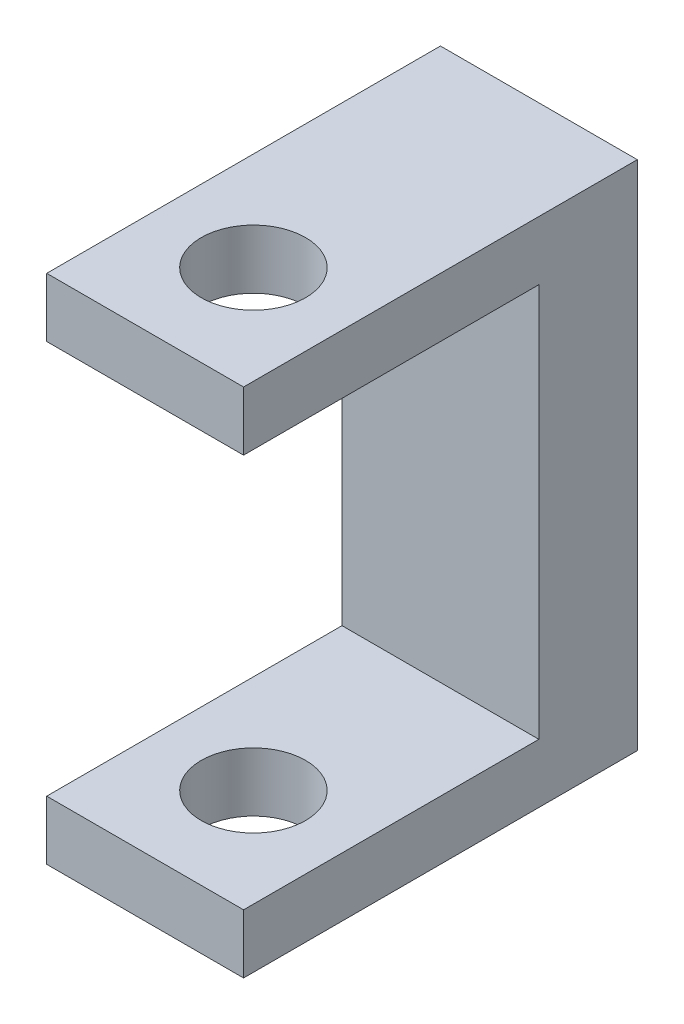
ISO-10303-21;
HEADER;
FILE_DESCRIPTION(('STEP AP214'),'2;1');
FILE_NAME('part.step','',(''),(''),'','','');
FILE_SCHEMA(('AUTOMOTIVE_DESIGN { 1 0 10303 214 1 1 1 1 }'));
ENDSEC;
DATA;
#1=APPLICATION_CONTEXT('core data for automotive mechanical design processes');
#2=APPLICATION_PROTOCOL_DEFINITION('international standard','automotive_design',2000,#1);
#3=PRODUCT_CONTEXT('',#1,'mechanical');
#4=PRODUCT('Part','Part','',(#3));
#5=PRODUCT_RELATED_PRODUCT_CATEGORY('part','',(#4));
#6=PRODUCT_DEFINITION_FORMATION('','',#4);
#7=PRODUCT_DEFINITION_CONTEXT('part definition',#1,'design');
#8=PRODUCT_DEFINITION('design','',#6,#7);
#9=PRODUCT_DEFINITION_SHAPE('','',#8);
#10=(LENGTH_UNIT() NAMED_UNIT(*) SI_UNIT(.MILLI.,.METRE.));
#11=(NAMED_UNIT(*) PLANE_ANGLE_UNIT() SI_UNIT($,.RADIAN.));
#12=(NAMED_UNIT(*) SI_UNIT($,.STERADIAN.) SOLID_ANGLE_UNIT());
#13=UNCERTAINTY_MEASURE_WITH_UNIT(LENGTH_MEASURE(1.E-05),#10,'distance_accuracy_value','');
#14=(GEOMETRIC_REPRESENTATION_CONTEXT(3) GLOBAL_UNCERTAINTY_ASSIGNED_CONTEXT((#13)) GLOBAL_UNIT_ASSIGNED_CONTEXT((#10,
#11,#12)) REPRESENTATION_CONTEXT('',''));
#15=CARTESIAN_POINT('',(0.,0.,0.));
#16=DIRECTION('',(0.,0.,1.));
#17=DIRECTION('',(1.,0.,0.));
#18=AXIS2_PLACEMENT_3D('',#15,#16,#17);
#19=CARTESIAN_POINT('',(0.,0.,20.));
#20=DIRECTION('',(0.,0.,-1.));
#21=DIRECTION('',(-1.,0.,0.));
#22=AXIS2_PLACEMENT_3D('',#19,#20,#21);
#23=PLANE('',#22);
#24=DIRECTION('',(0.,1.,0.));
#25=VECTOR('',#24,1.);
#26=CARTESIAN_POINT('',(5.,-13.,20.));
#27=LINE('',#26,#25);
#28=CARTESIAN_POINT('',(5.,-13.,20.));
#29=VERTEX_POINT('',#28);
#30=CARTESIAN_POINT('',(5.,-10.,20.));
#31=VERTEX_POINT('',#30);
#32=EDGE_CURVE('E158',#29,#31,#27,.T.);
#33=ORIENTED_EDGE('',*,*,#32,.T.);
#34=DIRECTION('',(1.,0.,0.));
#35=VECTOR('',#34,1.);
#36=CARTESIAN_POINT('',(-5.,-10.,20.));
#37=LINE('',#36,#35);
#38=CARTESIAN_POINT('',(-5.,-10.,20.));
#39=VERTEX_POINT('',#38);
#40=EDGE_CURVE('E137',#39,#31,#37,.T.);
#41=ORIENTED_EDGE('',*,*,#40,.F.);
#42=DIRECTION('',(0.,-1.,0.));
#43=VECTOR('',#42,1.);
#44=CARTESIAN_POINT('',(-5.,-13.,20.));
#45=LINE('',#44,#43);
#46=CARTESIAN_POINT('',(-5.,-13.,20.));
#47=VERTEX_POINT('',#46);
#48=EDGE_CURVE('E152',#39,#47,#45,.T.);
#49=ORIENTED_EDGE('',*,*,#48,.T.);
#50=DIRECTION('',(1.,0.,0.));
#51=VECTOR('',#50,1.);
#52=CARTESIAN_POINT('',(5.,-13.,20.));
#53=LINE('',#52,#51);
#54=EDGE_CURVE('E155',#47,#29,#53,.T.);
#55=ORIENTED_EDGE('',*,*,#54,.T.);
#56=EDGE_LOOP('',(#33,#41,#49,#55));
#57=FACE_BOUND('',#56,.T.);
#58=ADVANCED_FACE('F45',(#57),#23,.F.);
#59=CARTESIAN_POINT('',(5.,13.,20.));
#60=DIRECTION('',(0.,-1.,0.));
#61=DIRECTION('',(0.,0.,-1.));
#62=AXIS2_PLACEMENT_3D('',#59,#60,#61);
#63=PLANE('',#62);
#64=CARTESIAN_POINT('',(0.,13.,14.5));
#65=DIRECTION('',(0.,-1.,0.));
#66=DIRECTION('',(0.,0.,-1.));
#67=AXIS2_PLACEMENT_3D('',#64,#65,#66);
#68=CIRCLE('',#67,2.65);
#69=CARTESIAN_POINT('',(0.,13.,11.85));
#70=VERTEX_POINT('',#69);
#71=EDGE_CURVE('E313',#70,#70,#68,.T.);
#72=ORIENTED_EDGE('',*,*,#71,.T.);
#73=EDGE_LOOP('',(#72));
#74=FACE_BOUND('',#73,.T.);
#75=DIRECTION('',(-1.,0.,0.));
#76=VECTOR('',#75,1.);
#77=CARTESIAN_POINT('',(5.,13.,0.));
#78=LINE('',#77,#76);
#79=CARTESIAN_POINT('',(5.,13.,0.));
#80=VERTEX_POINT('',#79);
#81=CARTESIAN_POINT('',(-5.,13.,0.));
#82=VERTEX_POINT('',#81);
#83=EDGE_CURVE('E163',#80,#82,#78,.T.);
#84=ORIENTED_EDGE('',*,*,#83,.T.);
#85=DIRECTION('',(0.,0.,-1.));
#86=VECTOR('',#85,1.);
#87=CARTESIAN_POINT('',(-5.,13.,20.));
#88=LINE('',#87,#86);
#89=CARTESIAN_POINT('',(-5.,13.,20.));
#90=VERTEX_POINT('',#89);
#91=EDGE_CURVE('E11',#90,#82,#88,.T.);
#92=ORIENTED_EDGE('',*,*,#91,.F.);
#93=DIRECTION('',(-1.,0.,0.));
#94=VECTOR('',#93,1.);
#95=CARTESIAN_POINT('',(5.,13.,20.));
#96=LINE('',#95,#94);
#97=CARTESIAN_POINT('',(5.,13.,20.));
#98=VERTEX_POINT('',#97);
#99=EDGE_CURVE('E149',#98,#90,#96,.T.);
#100=ORIENTED_EDGE('',*,*,#99,.F.);
#101=DIRECTION('',(0.,0.,-1.));
#102=VECTOR('',#101,1.);
#103=CARTESIAN_POINT('',(5.,13.,20.));
#104=LINE('',#103,#102);
#105=EDGE_CURVE('E162',#98,#80,#104,.T.);
#106=ORIENTED_EDGE('',*,*,#105,.T.);
#107=EDGE_LOOP('',(#84,#92,#100,#106));
#108=FACE_BOUND('',#107,.T.);
#109=ADVANCED_FACE('F47',(#74,#108),#63,.F.);
#110=CARTESIAN_POINT('',(-5.,-13.,20.));
#111=DIRECTION('',(1.,0.,0.));
#112=DIRECTION('',(0.,0.,-1.));
#113=AXIS2_PLACEMENT_3D('',#110,#111,#112);
#114=PLANE('',#113);
#115=ORIENTED_EDGE('',*,*,#48,.F.);
#116=DIRECTION('',(0.,0.,1.));
#117=VECTOR('',#116,1.);
#118=CARTESIAN_POINT('',(-5.,-10.,5.));
#119=LINE('',#118,#117);
#120=CARTESIAN_POINT('',(-5.,-10.,5.));
#121=VERTEX_POINT('',#120);
#122=EDGE_CURVE('E144',#121,#39,#119,.T.);
#123=ORIENTED_EDGE('',*,*,#122,.F.);
#124=DIRECTION('',(0.,-1.,0.));
#125=VECTOR('',#124,1.);
#126=CARTESIAN_POINT('',(-5.,10.,5.));
#127=LINE('',#126,#125);
#128=CARTESIAN_POINT('',(-5.,10.,5.));
#129=VERTEX_POINT('',#128);
#130=EDGE_CURVE('E127',#129,#121,#127,.T.);
#131=ORIENTED_EDGE('',*,*,#130,.F.);
#132=DIRECTION('',(0.,0.,1.));
#133=VECTOR('',#132,1.);
#134=CARTESIAN_POINT('',(-5.,10.,5.));
#135=LINE('',#134,#133);
#136=CARTESIAN_POINT('',(-5.,10.,20.));
#137=VERTEX_POINT('',#136);
#138=EDGE_CURVE('E123',#129,#137,#135,.T.);
#139=ORIENTED_EDGE('',*,*,#138,.T.);
#140=EDGE_CURVE('E99',#90,#137,#45,.T.);
#141=ORIENTED_EDGE('',*,*,#140,.F.);
#142=ORIENTED_EDGE('',*,*,#91,.T.);
#143=DIRECTION('',(0.,-1.,0.));
#144=VECTOR('',#143,1.);
#145=CARTESIAN_POINT('',(-5.,-13.,0.));
#146=LINE('',#145,#144);
#147=CARTESIAN_POINT('',(-5.,-13.,0.));
#148=VERTEX_POINT('',#147);
#149=EDGE_CURVE('E167',#82,#148,#146,.T.);
#150=ORIENTED_EDGE('',*,*,#149,.T.);
#151=DIRECTION('',(0.,0.,-1.));
#152=VECTOR('',#151,1.);
#153=CARTESIAN_POINT('',(-5.,-13.,20.));
#154=LINE('',#153,#152);
#155=EDGE_CURVE('E55',#47,#148,#154,.T.);
#156=ORIENTED_EDGE('',*,*,#155,.F.);
#157=EDGE_LOOP('',(#115,#123,#131,#139,#141,#142,#150,#156));
#158=FACE_BOUND('',#157,.T.);
#159=ADVANCED_FACE('F216',(#158),#114,.F.);
#160=CARTESIAN_POINT('',(5.,-13.,20.));
#161=DIRECTION('',(0.,1.,0.));
#162=DIRECTION('',(0.,0.,1.));
#163=AXIS2_PLACEMENT_3D('',#160,#161,#162);
#164=PLANE('',#163);
#165=CARTESIAN_POINT('',(0.,-13.,14.5));
#166=DIRECTION('',(0.,-1.,0.));
#167=DIRECTION('',(0.,0.,-1.));
#168=AXIS2_PLACEMENT_3D('',#165,#166,#167);
#169=CIRCLE('',#168,2.65);
#170=CARTESIAN_POINT('',(0.,-13.,11.85));
#171=VERTEX_POINT('',#170);
#172=EDGE_CURVE('E310',#171,#171,#169,.T.);
#173=ORIENTED_EDGE('',*,*,#172,.F.);
#174=EDGE_LOOP('',(#173));
#175=FACE_BOUND('',#174,.T.);
#176=DIRECTION('',(1.,0.,0.));
#177=VECTOR('',#176,1.);
#178=CARTESIAN_POINT('',(5.,-13.,0.));
#179=LINE('',#178,#177);
#180=CARTESIAN_POINT('',(5.,-13.,0.));
#181=VERTEX_POINT('',#180);
#182=EDGE_CURVE('E171',#148,#181,#179,.T.);
#183=ORIENTED_EDGE('',*,*,#182,.T.);
#184=DIRECTION('',(0.,0.,-1.));
#185=VECTOR('',#184,1.);
#186=CARTESIAN_POINT('',(5.,-13.,20.));
#187=LINE('',#186,#185);
#188=EDGE_CURVE('E178',#29,#181,#187,.T.);
#189=ORIENTED_EDGE('',*,*,#188,.F.);
#190=ORIENTED_EDGE('',*,*,#54,.F.);
#191=ORIENTED_EDGE('',*,*,#155,.T.);
#192=EDGE_LOOP('',(#183,#189,#190,#191));
#193=FACE_BOUND('',#192,.T.);
#194=ADVANCED_FACE('F187',(#175,#193),#164,.F.);
#195=CARTESIAN_POINT('',(5.,-13.,20.));
#196=DIRECTION('',(-1.,0.,0.));
#197=DIRECTION('',(0.,0.,1.));
#198=AXIS2_PLACEMENT_3D('',#195,#196,#197);
#199=PLANE('',#198);
#200=DIRECTION('',(0.,1.,0.));
#201=VECTOR('',#200,1.);
#202=CARTESIAN_POINT('',(5.,10.,5.));
#203=LINE('',#202,#201);
#204=CARTESIAN_POINT('',(5.,-10.,5.));
#205=VERTEX_POINT('',#204);
#206=CARTESIAN_POINT('',(5.,10.,5.));
#207=VERTEX_POINT('',#206);
#208=EDGE_CURVE('E128',#205,#207,#203,.T.);
#209=ORIENTED_EDGE('',*,*,#208,.F.);
#210=DIRECTION('',(0.,0.,1.));
#211=VECTOR('',#210,1.);
#212=CARTESIAN_POINT('',(5.,-10.,5.));
#213=LINE('',#212,#211);
#214=EDGE_CURVE('E168',#205,#31,#213,.T.);
#215=ORIENTED_EDGE('',*,*,#214,.T.);
#216=ORIENTED_EDGE('',*,*,#32,.F.);
#217=ORIENTED_EDGE('',*,*,#188,.T.);
#218=DIRECTION('',(0.,1.,0.));
#219=VECTOR('',#218,1.);
#220=CARTESIAN_POINT('',(5.,-13.,0.));
#221=LINE('',#220,#219);
#222=EDGE_CURVE('E92',#181,#80,#221,.T.);
#223=ORIENTED_EDGE('',*,*,#222,.T.);
#224=ORIENTED_EDGE('',*,*,#105,.F.);
#225=CARTESIAN_POINT('',(5.,9.99999999999999,20.));
#226=VERTEX_POINT('',#225);
#227=EDGE_CURVE('E70',#226,#98,#27,.T.);
#228=ORIENTED_EDGE('',*,*,#227,.F.);
#229=DIRECTION('',(0.,0.,1.));
#230=VECTOR('',#229,1.);
#231=CARTESIAN_POINT('',(5.,10.,5.));
#232=LINE('',#231,#230);
#233=EDGE_CURVE('E62',#207,#226,#232,.T.);
#234=ORIENTED_EDGE('',*,*,#233,.F.);
#235=EDGE_LOOP('',(#209,#215,#216,#217,#223,#224,#228,#234));
#236=FACE_BOUND('',#235,.T.);
#237=ADVANCED_FACE('F139',(#236),#199,.F.);
#238=ORIENTED_EDGE('',*,*,#140,.T.);
#239=DIRECTION('',(-1.,0.,0.));
#240=VECTOR('',#239,1.);
#241=CARTESIAN_POINT('',(-5.,10.,20.));
#242=LINE('',#241,#240);
#243=EDGE_CURVE('E197',#226,#137,#242,.T.);
#244=ORIENTED_EDGE('',*,*,#243,.F.);
#245=ORIENTED_EDGE('',*,*,#227,.T.);
#246=ORIENTED_EDGE('',*,*,#99,.T.);
#247=EDGE_LOOP('',(#238,#244,#245,#246));
#248=FACE_BOUND('',#247,.T.);
#249=ADVANCED_FACE('F196',(#248),#23,.F.);
#250=CARTESIAN_POINT('',(0.,0.,0.));
#251=DIRECTION('',(0.,0.,-1.));
#252=DIRECTION('',(-1.,0.,0.));
#253=AXIS2_PLACEMENT_3D('',#250,#251,#252);
#254=PLANE('',#253);
#255=ORIENTED_EDGE('',*,*,#83,.F.);
#256=ORIENTED_EDGE('',*,*,#222,.F.);
#257=ORIENTED_EDGE('',*,*,#182,.F.);
#258=ORIENTED_EDGE('',*,*,#149,.F.);
#259=EDGE_LOOP('',(#255,#256,#257,#258));
#260=FACE_BOUND('',#259,.T.);
#261=ADVANCED_FACE('F192',(#260),#254,.T.);
#262=CARTESIAN_POINT('',(-5.,-10.,5.));
#263=DIRECTION('',(0.,-1.,0.));
#264=DIRECTION('',(0.,0.,-1.));
#265=AXIS2_PLACEMENT_3D('',#262,#263,#264);
#266=PLANE('',#265);
#267=CARTESIAN_POINT('',(0.,-10.,14.5));
#268=DIRECTION('',(0.,-1.,0.));
#269=DIRECTION('',(0.,0.,-1.));
#270=AXIS2_PLACEMENT_3D('',#267,#268,#269);
#271=CIRCLE('',#270,2.65);
#272=CARTESIAN_POINT('',(0.,-10.,11.85));
#273=VERTEX_POINT('',#272);
#274=EDGE_CURVE('E199',#273,#273,#271,.T.);
#275=ORIENTED_EDGE('',*,*,#274,.T.);
#276=EDGE_LOOP('',(#275));
#277=FACE_BOUND('',#276,.T.);
#278=ORIENTED_EDGE('',*,*,#40,.T.);
#279=ORIENTED_EDGE('',*,*,#214,.F.);
#280=DIRECTION('',(1.,0.,0.));
#281=VECTOR('',#280,1.);
#282=CARTESIAN_POINT('',(-5.,-10.,5.));
#283=LINE('',#282,#281);
#284=EDGE_CURVE('E134',#121,#205,#283,.T.);
#285=ORIENTED_EDGE('',*,*,#284,.F.);
#286=ORIENTED_EDGE('',*,*,#122,.T.);
#287=EDGE_LOOP('',(#278,#279,#285,#286));
#288=FACE_BOUND('',#287,.T.);
#289=ADVANCED_FACE('F213',(#277,#288),#266,.F.);
#290=CARTESIAN_POINT('',(-5.,10.,5.));
#291=DIRECTION('',(0.,1.,0.));
#292=DIRECTION('',(0.,0.,1.));
#293=AXIS2_PLACEMENT_3D('',#290,#291,#292);
#294=PLANE('',#293);
#295=CARTESIAN_POINT('',(0.,10.,14.5));
#296=DIRECTION('',(0.,1.,0.));
#297=DIRECTION('',(0.,0.,1.));
#298=AXIS2_PLACEMENT_3D('',#295,#296,#297);
#299=CIRCLE('',#298,2.65);
#300=CARTESIAN_POINT('',(0.,10.,11.85));
#301=VERTEX_POINT('',#300);
#302=EDGE_CURVE('E49',#301,#301,#299,.T.);
#303=ORIENTED_EDGE('',*,*,#302,.T.);
#304=EDGE_LOOP('',(#303));
#305=FACE_BOUND('',#304,.T.);
#306=ORIENTED_EDGE('',*,*,#243,.T.);
#307=ORIENTED_EDGE('',*,*,#138,.F.);
#308=DIRECTION('',(-1.,0.,0.));
#309=VECTOR('',#308,1.);
#310=CARTESIAN_POINT('',(-5.,10.,5.));
#311=LINE('',#310,#309);
#312=EDGE_CURVE('E120',#207,#129,#311,.T.);
#313=ORIENTED_EDGE('',*,*,#312,.F.);
#314=ORIENTED_EDGE('',*,*,#233,.T.);
#315=EDGE_LOOP('',(#306,#307,#313,#314));
#316=FACE_BOUND('',#315,.T.);
#317=ADVANCED_FACE('F122',(#305,#316),#294,.F.);
#318=CARTESIAN_POINT('',(0.,0.,5.));
#319=DIRECTION('',(0.,0.,1.));
#320=DIRECTION('',(1.,0.,0.));
#321=AXIS2_PLACEMENT_3D('',#318,#319,#320);
#322=PLANE('',#321);
#323=ORIENTED_EDGE('',*,*,#208,.T.);
#324=ORIENTED_EDGE('',*,*,#312,.T.);
#325=ORIENTED_EDGE('',*,*,#130,.T.);
#326=ORIENTED_EDGE('',*,*,#284,.T.);
#327=EDGE_LOOP('',(#323,#324,#325,#326));
#328=FACE_BOUND('',#327,.T.);
#329=ADVANCED_FACE('F132',(#328),#322,.T.);
#330=CARTESIAN_POINT('',(0.,13.,14.5));
#331=DIRECTION('',(0.,-1.,0.));
#332=DIRECTION('',(0.,0.,-1.));
#333=AXIS2_PLACEMENT_3D('',#330,#331,#332);
#334=CYLINDRICAL_SURFACE('',#333,2.65);
#335=CARTESIAN_POINT('',(0.,13.,11.85));
#336=CARTESIAN_POINT('',(0.,12.96875,11.85));
#337=CARTESIAN_POINT('',(0.,12.9375,11.85));
#338=CARTESIAN_POINT('',(0.,12.875,11.85));
#339=CARTESIAN_POINT('',(0.,12.84375,11.85));
#340=CARTESIAN_POINT('',(0.,12.78125,11.85));
#341=CARTESIAN_POINT('',(0.,12.75,11.85));
#342=CARTESIAN_POINT('',(0.,12.6875,11.85));
#343=CARTESIAN_POINT('',(0.,12.65625,11.85));
#344=CARTESIAN_POINT('',(0.,12.59375,11.85));
#345=CARTESIAN_POINT('',(0.,12.5625,11.85));
#346=CARTESIAN_POINT('',(0.,12.5,11.85));
#347=CARTESIAN_POINT('',(0.,12.46875,11.85));
#348=CARTESIAN_POINT('',(0.,12.40625,11.85));
#349=CARTESIAN_POINT('',(0.,12.375,11.85));
#350=CARTESIAN_POINT('',(0.,12.3125,11.85));
#351=CARTESIAN_POINT('',(0.,12.28125,11.85));
#352=CARTESIAN_POINT('',(0.,12.21875,11.85));
#353=CARTESIAN_POINT('',(0.,12.1875,11.85));
#354=CARTESIAN_POINT('',(0.,12.125,11.85));
#355=CARTESIAN_POINT('',(0.,12.09375,11.85));
#356=CARTESIAN_POINT('',(0.,12.03125,11.85));
#357=CARTESIAN_POINT('',(0.,12.,11.85));
#358=CARTESIAN_POINT('',(0.,11.9375,11.85));
#359=CARTESIAN_POINT('',(0.,11.90625,11.85));
#360=CARTESIAN_POINT('',(0.,11.84375,11.85));
#361=CARTESIAN_POINT('',(0.,11.8125,11.85));
#362=CARTESIAN_POINT('',(0.,11.75,11.85));
#363=CARTESIAN_POINT('',(0.,11.71875,11.85));
#364=CARTESIAN_POINT('',(0.,11.65625,11.85));
#365=CARTESIAN_POINT('',(0.,11.625,11.85));
#366=CARTESIAN_POINT('',(0.,11.5625,11.85));
#367=CARTESIAN_POINT('',(0.,11.53125,11.85));
#368=CARTESIAN_POINT('',(0.,11.46875,11.85));
#369=CARTESIAN_POINT('',(0.,11.4375,11.85));
#370=CARTESIAN_POINT('',(0.,11.375,11.85));
#371=CARTESIAN_POINT('',(0.,11.34375,11.85));
#372=CARTESIAN_POINT('',(0.,11.28125,11.85));
#373=CARTESIAN_POINT('',(0.,11.25,11.85));
#374=CARTESIAN_POINT('',(0.,11.1875,11.85));
#375=CARTESIAN_POINT('',(0.,11.15625,11.85));
#376=CARTESIAN_POINT('',(0.,11.09375,11.85));
#377=CARTESIAN_POINT('',(0.,11.0625,11.85));
#378=CARTESIAN_POINT('',(0.,11.,11.85));
#379=CARTESIAN_POINT('',(0.,10.96875,11.85));
#380=CARTESIAN_POINT('',(0.,10.90625,11.85));
#381=CARTESIAN_POINT('',(0.,10.875,11.85));
#382=CARTESIAN_POINT('',(0.,10.8125,11.85));
#383=CARTESIAN_POINT('',(0.,10.78125,11.85));
#384=CARTESIAN_POINT('',(0.,10.71875,11.85));
#385=CARTESIAN_POINT('',(0.,10.6875,11.85));
#386=CARTESIAN_POINT('',(0.,10.625,11.85));
#387=CARTESIAN_POINT('',(0.,10.59375,11.85));
#388=CARTESIAN_POINT('',(0.,10.53125,11.85));
#389=CARTESIAN_POINT('',(0.,10.5,11.85));
#390=CARTESIAN_POINT('',(0.,10.4375,11.85));
#391=CARTESIAN_POINT('',(0.,10.40625,11.85));
#392=CARTESIAN_POINT('',(0.,10.34375,11.85));
#393=CARTESIAN_POINT('',(0.,10.3125,11.85));
#394=CARTESIAN_POINT('',(0.,10.25,11.85));
#395=CARTESIAN_POINT('',(0.,10.21875,11.85));
#396=CARTESIAN_POINT('',(0.,10.15625,11.85));
#397=CARTESIAN_POINT('',(0.,10.125,11.85));
#398=CARTESIAN_POINT('',(0.,10.0625,11.85));
#399=CARTESIAN_POINT('',(0.,10.03125,11.85));
#400=CARTESIAN_POINT('',(0.,10.,11.85));
#401=B_SPLINE_CURVE_WITH_KNOTS('',3,(#335,#336,#337,#338,#339,#340,#341,#342,#343,#344,#345,
#346,#347,#348,#349,#350,#351,#352,#353,#354,#355,#356,#357,#358,#359,#360,#361,#362,#363,#364,
#365,#366,#367,#368,#369,#370,#371,#372,#373,#374,#375,#376,#377,#378,#379,#380,#381,#382,#383,
#384,#385,#386,#387,#388,#389,#390,#391,#392,#393,#394,#395,#396,#397,#398,#399,#400),
.UNSPECIFIED.,.F.,.F.,(4,2,2,2,2,2,2,2,2,2,2,2,2,2,2,2,2,2,2,2,2,2,2,2,2,2,2,2,2,2,2,2,4),(0.,
0.0937500000000001,0.1875,0.28125,0.375,0.46875,0.5625,0.656250000000001,0.750000000000001,
0.843750000000001,0.937500000000001,1.03125,1.125,1.21875,1.3125,1.40625,1.5,1.59375,1.6875,
1.78125,1.875,1.96875,2.0625,2.15625,2.25,2.34375,2.4375,2.53125,2.625,2.71875,2.8125,2.90625,
3.),.UNSPECIFIED.);
#402=EDGE_CURVE('BSEAM287',#70,#301,#401,.T.);
#403=ORIENTED_EDGE('',*,*,#71,.F.);
#404=ORIENTED_EDGE('',*,*,#302,.F.);
#405=ORIENTED_EDGE('',*,*,#402,.T.);
#406=ORIENTED_EDGE('',*,*,#402,.F.);
#407=EDGE_LOOP('',(#403,#405,#404,#406));
#408=FACE_BOUND('',#407,.T.);
#409=ADVANCED_FACE('F287',(#408),#334,.F.);
#410=CARTESIAN_POINT('',(0.,-13.,11.85));
#411=CARTESIAN_POINT('',(0.,-12.96875,11.85));
#412=CARTESIAN_POINT('',(0.,-12.9375,11.85));
#413=CARTESIAN_POINT('',(0.,-12.875,11.85));
#414=CARTESIAN_POINT('',(0.,-12.84375,11.85));
#415=CARTESIAN_POINT('',(0.,-12.78125,11.85));
#416=CARTESIAN_POINT('',(0.,-12.75,11.85));
#417=CARTESIAN_POINT('',(0.,-12.6875,11.85));
#418=CARTESIAN_POINT('',(0.,-12.65625,11.85));
#419=CARTESIAN_POINT('',(0.,-12.59375,11.85));
#420=CARTESIAN_POINT('',(0.,-12.5625,11.85));
#421=CARTESIAN_POINT('',(0.,-12.5,11.85));
#422=CARTESIAN_POINT('',(0.,-12.46875,11.85));
#423=CARTESIAN_POINT('',(0.,-12.40625,11.85));
#424=CARTESIAN_POINT('',(0.,-12.375,11.85));
#425=CARTESIAN_POINT('',(0.,-12.3125,11.85));
#426=CARTESIAN_POINT('',(0.,-12.28125,11.85));
#427=CARTESIAN_POINT('',(0.,-12.21875,11.85));
#428=CARTESIAN_POINT('',(0.,-12.1875,11.85));
#429=CARTESIAN_POINT('',(0.,-12.125,11.85));
#430=CARTESIAN_POINT('',(0.,-12.09375,11.85));
#431=CARTESIAN_POINT('',(0.,-12.03125,11.85));
#432=CARTESIAN_POINT('',(0.,-12.,11.85));
#433=CARTESIAN_POINT('',(0.,-11.9375,11.85));
#434=CARTESIAN_POINT('',(0.,-11.90625,11.85));
#435=CARTESIAN_POINT('',(0.,-11.84375,11.85));
#436=CARTESIAN_POINT('',(0.,-11.8125,11.85));
#437=CARTESIAN_POINT('',(0.,-11.75,11.85));
#438=CARTESIAN_POINT('',(0.,-11.71875,11.85));
#439=CARTESIAN_POINT('',(0.,-11.65625,11.85));
#440=CARTESIAN_POINT('',(0.,-11.625,11.85));
#441=CARTESIAN_POINT('',(0.,-11.5625,11.85));
#442=CARTESIAN_POINT('',(0.,-11.53125,11.85));
#443=CARTESIAN_POINT('',(0.,-11.46875,11.85));
#444=CARTESIAN_POINT('',(0.,-11.4375,11.85));
#445=CARTESIAN_POINT('',(0.,-11.375,11.85));
#446=CARTESIAN_POINT('',(0.,-11.34375,11.85));
#447=CARTESIAN_POINT('',(0.,-11.28125,11.85));
#448=CARTESIAN_POINT('',(0.,-11.25,11.85));
#449=CARTESIAN_POINT('',(0.,-11.1875,11.85));
#450=CARTESIAN_POINT('',(0.,-11.15625,11.85));
#451=CARTESIAN_POINT('',(0.,-11.09375,11.85));
#452=CARTESIAN_POINT('',(0.,-11.0625,11.85));
#453=CARTESIAN_POINT('',(0.,-11.,11.85));
#454=CARTESIAN_POINT('',(0.,-10.96875,11.85));
#455=CARTESIAN_POINT('',(0.,-10.90625,11.85));
#456=CARTESIAN_POINT('',(0.,-10.875,11.85));
#457=CARTESIAN_POINT('',(0.,-10.8125,11.85));
#458=CARTESIAN_POINT('',(0.,-10.78125,11.85));
#459=CARTESIAN_POINT('',(0.,-10.71875,11.85));
#460=CARTESIAN_POINT('',(0.,-10.6875,11.85));
#461=CARTESIAN_POINT('',(0.,-10.625,11.85));
#462=CARTESIAN_POINT('',(0.,-10.59375,11.85));
#463=CARTESIAN_POINT('',(0.,-10.53125,11.85));
#464=CARTESIAN_POINT('',(0.,-10.5,11.85));
#465=CARTESIAN_POINT('',(0.,-10.4375,11.85));
#466=CARTESIAN_POINT('',(0.,-10.40625,11.85));
#467=CARTESIAN_POINT('',(0.,-10.34375,11.85));
#468=CARTESIAN_POINT('',(0.,-10.3125,11.85));
#469=CARTESIAN_POINT('',(0.,-10.25,11.85));
#470=CARTESIAN_POINT('',(0.,-10.21875,11.85));
#471=CARTESIAN_POINT('',(0.,-10.15625,11.85));
#472=CARTESIAN_POINT('',(0.,-10.125,11.85));
#473=CARTESIAN_POINT('',(0.,-10.0625,11.85));
#474=CARTESIAN_POINT('',(0.,-10.03125,11.85));
#475=CARTESIAN_POINT('',(0.,-10.,11.85));
#476=B_SPLINE_CURVE_WITH_KNOTS('',3,(#410,#411,#412,#413,#414,#415,#416,#417,#418,#419,#420,
#421,#422,#423,#424,#425,#426,#427,#428,#429,#430,#431,#432,#433,#434,#435,#436,#437,#438,#439,
#440,#441,#442,#443,#444,#445,#446,#447,#448,#449,#450,#451,#452,#453,#454,#455,#456,#457,#458,
#459,#460,#461,#462,#463,#464,#465,#466,#467,#468,#469,#470,#471,#472,#473,#474,#475),
.UNSPECIFIED.,.F.,.F.,(4,2,2,2,2,2,2,2,2,2,2,2,2,2,2,2,2,2,2,2,2,2,2,2,2,2,2,2,2,2,2,2,4),(0.,
0.0937500000000001,0.1875,0.28125,0.375,0.46875,0.5625,0.656250000000001,0.750000000000001,
0.843750000000001,0.937500000000001,1.03125,1.125,1.21875,1.3125,1.40625,1.5,1.59375,1.6875,
1.78125,1.875,1.96875,2.0625,2.15625,2.25,2.34375,2.4375,2.53125,2.625,2.71875,2.8125,2.90625,
3.),.UNSPECIFIED.);
#477=EDGE_CURVE('BSEAM295',#171,#273,#476,.T.);
#478=ORIENTED_EDGE('',*,*,#172,.T.);
#479=ORIENTED_EDGE('',*,*,#274,.F.);
#480=ORIENTED_EDGE('',*,*,#477,.T.);
#481=ORIENTED_EDGE('',*,*,#477,.F.);
#482=EDGE_LOOP('',(#478,#480,#479,#481));
#483=FACE_BOUND('',#482,.T.);
#484=ADVANCED_FACE('F295',(#483),#334,.F.);
#485=CLOSED_SHELL('',(#58,#109,#159,#194,#237,#249,#261,#289,#317,#329,#409,#484));
#486=MANIFOLD_SOLID_BREP('B2',#485);
#487=ADVANCED_BREP_SHAPE_REPRESENTATION('',(#18,#486),#14);
#488=SHAPE_DEFINITION_REPRESENTATION(#9,#487);
ENDSEC;
END-ISO-10303-21;
